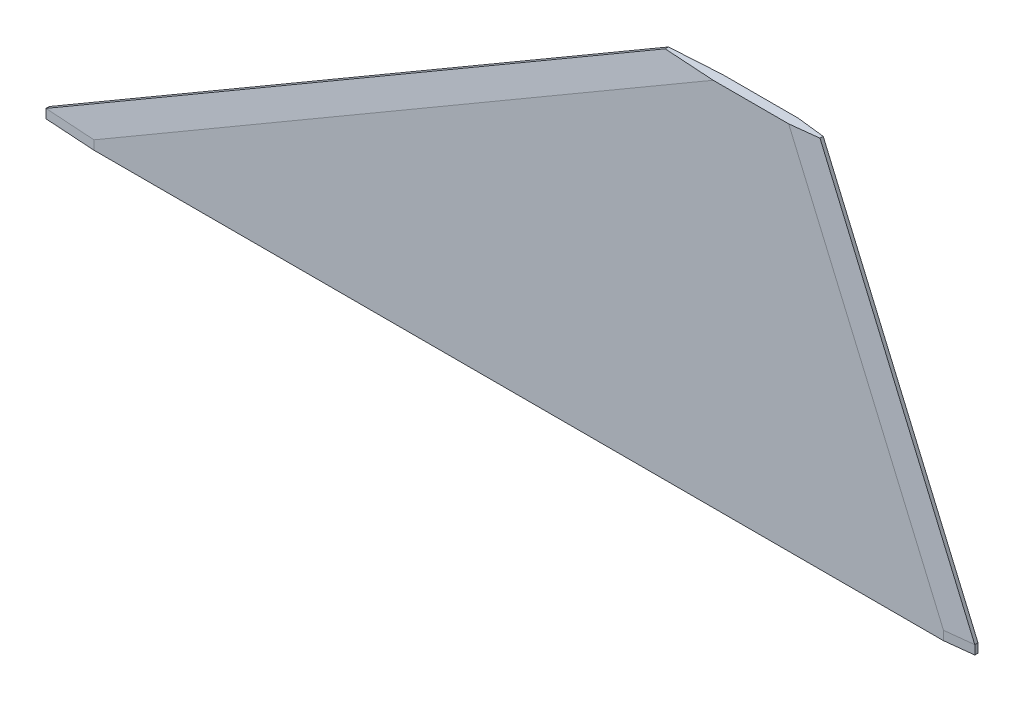
ISO-10303-21;
HEADER;
FILE_DESCRIPTION(('STEP AP214'),'2;1');
FILE_NAME('part.step','',(''),(''),'','','');
FILE_SCHEMA(('AUTOMOTIVE_DESIGN { 1 0 10303 214 1 1 1 1 }'));
ENDSEC;
DATA;
#1=APPLICATION_CONTEXT('core data for automotive mechanical design processes');
#2=APPLICATION_PROTOCOL_DEFINITION('international standard','automotive_design',2000,#1);
#3=PRODUCT_CONTEXT('',#1,'mechanical');
#4=PRODUCT('Part','Part','',(#3));
#5=PRODUCT_RELATED_PRODUCT_CATEGORY('part','',(#4));
#6=PRODUCT_DEFINITION_FORMATION('','',#4);
#7=PRODUCT_DEFINITION_CONTEXT('part definition',#1,'design');
#8=PRODUCT_DEFINITION('design','',#6,#7);
#9=PRODUCT_DEFINITION_SHAPE('','',#8);
#10=(LENGTH_UNIT() NAMED_UNIT(*) SI_UNIT(.MILLI.,.METRE.));
#11=(NAMED_UNIT(*) PLANE_ANGLE_UNIT() SI_UNIT($,.RADIAN.));
#12=(NAMED_UNIT(*) SI_UNIT($,.STERADIAN.) SOLID_ANGLE_UNIT());
#13=UNCERTAINTY_MEASURE_WITH_UNIT(LENGTH_MEASURE(1.E-05),#10,'distance_accuracy_value','');
#14=(GEOMETRIC_REPRESENTATION_CONTEXT(3) GLOBAL_UNCERTAINTY_ASSIGNED_CONTEXT((#13)) GLOBAL_UNIT_ASSIGNED_CONTEXT((#10,
#11,#12)) REPRESENTATION_CONTEXT('',''));
#15=CARTESIAN_POINT('',(0.,0.,0.));
#16=DIRECTION('',(0.,0.,1.));
#17=DIRECTION('',(1.,0.,0.));
#18=AXIS2_PLACEMENT_3D('',#15,#16,#17);
#19=CARTESIAN_POINT('',(304.8,177.8,4.7625));
#20=DIRECTION('',(0.503871025524086,-0.863778900898433,0.));
#21=DIRECTION('',(0.863778900898433,0.503871025524086,0.));
#22=AXIS2_PLACEMENT_3D('',#19,#20,#21);
#23=PLANE('',#22);
#24=DIRECTION('',(0.,0.,-1.));
#25=VECTOR('',#24,1.);
#26=CARTESIAN_POINT('',(304.8,177.8,4.7625));
#27=LINE('',#26,#25);
#28=CARTESIAN_POINT('',(304.8,177.8,3.17499999999999));
#29=VERTEX_POINT('',#28);
#30=CARTESIAN_POINT('',(304.8,177.8,1.5875));
#31=VERTEX_POINT('',#30);
#32=EDGE_CURVE('E154',#29,#31,#27,.T.);
#33=ORIENTED_EDGE('',*,*,#32,.T.);
#34=DIRECTION('',(-0.863778900898433,-0.503871025524086,0.));
#35=VECTOR('',#34,1.);
#36=CARTESIAN_POINT('',(0.,0.,1.5875));
#37=LINE('',#36,#35);
#38=CARTESIAN_POINT('',(0.,0.,1.5875));
#39=VERTEX_POINT('',#38);
#40=EDGE_CURVE('E168',#31,#39,#37,.T.);
#41=ORIENTED_EDGE('',*,*,#40,.T.);
#42=DIRECTION('',(0.,0.,-1.));
#43=VECTOR('',#42,1.);
#44=CARTESIAN_POINT('',(0.,0.,4.7625));
#45=LINE('',#44,#43);
#46=CARTESIAN_POINT('',(0.,0.,3.17499999999999));
#47=VERTEX_POINT('',#46);
#48=EDGE_CURVE('E163',#47,#39,#45,.T.);
#49=ORIENTED_EDGE('',*,*,#48,.F.);
#50=DIRECTION('',(0.863778900898433,0.503871025524086,0.));
#51=VECTOR('',#50,1.);
#52=CARTESIAN_POINT('',(304.8,177.8,3.17499999999999));
#53=LINE('',#52,#51);
#54=EDGE_CURVE('E166',#47,#29,#53,.T.);
#55=ORIENTED_EDGE('',*,*,#54,.T.);
#56=EDGE_LOOP('',(#33,#41,#49,#55));
#57=FACE_BOUND('',#56,.T.);
#58=ADVANCED_FACE('F34',(#57),#23,.F.);
#59=CARTESIAN_POINT('',(457.2,0.,4.7625));
#60=DIRECTION('',(-0.919145030018058,-0.393919298579168,0.));
#61=DIRECTION('',(0.393919298579168,-0.919145030018058,0.));
#62=AXIS2_PLACEMENT_3D('',#59,#60,#61);
#63=PLANE('',#62);
#64=DIRECTION('',(0.,0.,-1.));
#65=VECTOR('',#64,1.);
#66=CARTESIAN_POINT('',(457.2,0.,4.7625));
#67=LINE('',#66,#65);
#68=CARTESIAN_POINT('',(457.2,0.,3.17499999999998));
#69=VERTEX_POINT('',#68);
#70=CARTESIAN_POINT('',(457.2,0.,1.5875));
#71=VERTEX_POINT('',#70);
#72=EDGE_CURVE('E161',#69,#71,#67,.T.);
#73=ORIENTED_EDGE('',*,*,#72,.T.);
#74=DIRECTION('',(-0.393919298579168,0.919145030018058,0.));
#75=VECTOR('',#74,1.);
#76=CARTESIAN_POINT('',(381.,177.8,1.5875));
#77=LINE('',#76,#75);
#78=CARTESIAN_POINT('',(381.,177.8,1.5875));
#79=VERTEX_POINT('',#78);
#80=EDGE_CURVE('E187',#71,#79,#77,.T.);
#81=ORIENTED_EDGE('',*,*,#80,.T.);
#82=DIRECTION('',(0.,0.,-1.));
#83=VECTOR('',#82,1.);
#84=CARTESIAN_POINT('',(381.,177.8,4.7625));
#85=LINE('',#84,#83);
#86=CARTESIAN_POINT('',(381.,177.8,3.17499999999998));
#87=VERTEX_POINT('',#86);
#88=EDGE_CURVE('E158',#87,#79,#85,.T.);
#89=ORIENTED_EDGE('',*,*,#88,.F.);
#90=DIRECTION('',(0.393919298579168,-0.919145030018058,0.));
#91=VECTOR('',#90,1.);
#92=CARTESIAN_POINT('',(457.2,0.,3.17499999999998));
#93=LINE('',#92,#91);
#94=EDGE_CURVE('E185',#87,#69,#93,.T.);
#95=ORIENTED_EDGE('',*,*,#94,.T.);
#96=EDGE_LOOP('',(#73,#81,#89,#95));
#97=FACE_BOUND('',#96,.T.);
#98=ADVANCED_FACE('F263',(#97),#63,.F.);
#99=CARTESIAN_POINT('',(381.,177.8,4.7625));
#100=DIRECTION('',(0.,-1.,0.));
#101=DIRECTION('',(0.,0.,-1.));
#102=AXIS2_PLACEMENT_3D('',#99,#100,#101);
#103=PLANE('',#102);
#104=ORIENTED_EDGE('',*,*,#88,.T.);
#105=DIRECTION('',(-0.993464418144731,0.,-0.114142235304689));
#106=VECTOR('',#105,1.);
#107=CARTESIAN_POINT('',(456.207232119117,177.8,10.2282942029627));
#108=LINE('',#107,#106);
#109=CARTESIAN_POINT('',(367.18281165079,177.8,0.));
#110=VERTEX_POINT('',#109);
#111=EDGE_CURVE('E192',#79,#110,#108,.T.);
#112=ORIENTED_EDGE('',*,*,#111,.T.);
#113=DIRECTION('',(-1.,0.,0.));
#114=VECTOR('',#113,1.);
#115=CARTESIAN_POINT('',(381.,177.8,0.));
#116=LINE('',#115,#114);
#117=CARTESIAN_POINT('',(330.004862666573,177.8,0.));
#118=VERTEX_POINT('',#117);
#119=EDGE_CURVE('E146',#110,#118,#116,.T.);
#120=ORIENTED_EDGE('',*,*,#119,.T.);
#121=DIRECTION('',(-0.998022397418784,0.,0.0628593211104263));
#122=VECTOR('',#121,1.);
#123=CARTESIAN_POINT('',(304.8,177.8,1.5875));
#124=LINE('',#123,#122);
#125=EDGE_CURVE('E180',#118,#31,#124,.T.);
#126=ORIENTED_EDGE('',*,*,#125,.T.);
#127=ORIENTED_EDGE('',*,*,#32,.F.);
#128=DIRECTION('',(-0.998022397418784,0.,-0.0628593211104246));
#129=VECTOR('',#128,1.);
#130=CARTESIAN_POINT('',(7.67782336852167,177.8,-15.538906980656));
#131=LINE('',#130,#129);
#132=CARTESIAN_POINT('',(330.004862666574,177.8,4.7625));
#133=VERTEX_POINT('',#132);
#134=EDGE_CURVE('E177',#29,#133,#131,.F.);
#135=ORIENTED_EDGE('',*,*,#134,.T.);
#136=DIRECTION('',(-1.,0.,0.));
#137=VECTOR('',#136,1.);
#138=CARTESIAN_POINT('',(381.,177.8,4.7625));
#139=LINE('',#138,#137);
#140=CARTESIAN_POINT('',(367.182811650789,177.8,4.7625));
#141=VERTEX_POINT('',#140);
#142=EDGE_CURVE('E148',#141,#133,#139,.T.);
#143=ORIENTED_EDGE('',*,*,#142,.F.);
#144=DIRECTION('',(-0.993464418144731,0.,0.114142235304686));
#145=VECTOR('',#144,1.);
#146=CARTESIAN_POINT('',(374.485630180208,177.8,3.9234563304451));
#147=LINE('',#146,#145);
#148=EDGE_CURVE('E190',#141,#87,#147,.F.);
#149=ORIENTED_EDGE('',*,*,#148,.T.);
#150=EDGE_LOOP('',(#104,#112,#120,#126,#127,#135,#143,#149));
#151=FACE_BOUND('',#150,.T.);
#152=ADVANCED_FACE('F256',(#151),#103,.F.);
#153=CARTESIAN_POINT('',(0.,0.,4.7625));
#154=DIRECTION('',(0.,0.,-1.));
#155=DIRECTION('',(-1.,0.,0.));
#156=AXIS2_PLACEMENT_3D('',#153,#154,#155);
#157=PLANE('',#156);
#158=DIRECTION('',(-0.863778900898433,-0.503871025524086,0.));
#159=VECTOR('',#158,1.);
#160=CARTESIAN_POINT('',(6.39916202415609,-10.9699920414104,4.7625));
#161=LINE('',#160,#159);
#162=CARTESIAN_POINT('',(25.204862666574,0.,4.7625));
#163=VERTEX_POINT('',#162);
#164=EDGE_CURVE('E182',#133,#163,#161,.T.);
#165=ORIENTED_EDGE('',*,*,#164,.T.);
#166=DIRECTION('',(0.,1.,0.));
#167=VECTOR('',#166,1.);
#168=CARTESIAN_POINT('',(25.204862666574,-4.445,4.7625));
#169=LINE('',#168,#167);
#170=CARTESIAN_POINT('',(25.204862666574,-4.445,4.7625));
#171=VERTEX_POINT('',#170);
#172=EDGE_CURVE('E216',#171,#163,#169,.T.);
#173=ORIENTED_EDGE('',*,*,#172,.F.);
#174=DIRECTION('',(-1.,0.,0.));
#175=VECTOR('',#174,1.);
#176=CARTESIAN_POINT('',(443.382811650789,-4.445,4.7625));
#177=LINE('',#176,#175);
#178=CARTESIAN_POINT('',(443.382811650789,-4.445,4.7625));
#179=VERTEX_POINT('',#178);
#180=EDGE_CURVE('E227',#179,#171,#177,.T.);
#181=ORIENTED_EDGE('',*,*,#180,.F.);
#182=DIRECTION('',(0.,1.,0.));
#183=VECTOR('',#182,1.);
#184=CARTESIAN_POINT('',(443.382811650789,-4.445,4.7625));
#185=LINE('',#184,#183);
#186=CARTESIAN_POINT('',(443.382811650789,0.,4.7625));
#187=VERTEX_POINT('',#186);
#188=EDGE_CURVE('E211',#179,#187,#185,.T.);
#189=ORIENTED_EDGE('',*,*,#188,.T.);
#190=DIRECTION('',(-0.393919298579168,0.919145030018058,0.));
#191=VECTOR('',#190,1.);
#192=CARTESIAN_POINT('',(374.582030532563,160.535155942527,4.7625));
#193=LINE('',#192,#191);
#194=EDGE_CURVE('E11',#187,#141,#193,.T.);
#195=ORIENTED_EDGE('',*,*,#194,.T.);
#196=ORIENTED_EDGE('',*,*,#142,.T.);
#197=EDGE_LOOP('',(#165,#173,#181,#189,#195,#196));
#198=FACE_BOUND('',#197,.T.);
#199=ADVANCED_FACE('F239',(#198),#157,.F.);
#200=CARTESIAN_POINT('',(0.,0.,0.));
#201=DIRECTION('',(0.,0.,-1.));
#202=DIRECTION('',(-1.,0.,0.));
#203=AXIS2_PLACEMENT_3D('',#200,#201,#202);
#204=PLANE('',#203);
#205=ORIENTED_EDGE('',*,*,#119,.F.);
#206=DIRECTION('',(0.393919298579168,-0.919145030018058,0.));
#207=VECTOR('',#206,1.);
#208=CARTESIAN_POINT('',(445.526858118771,-5.00277509195542,0.));
#209=LINE('',#208,#207);
#210=CARTESIAN_POINT('',(443.38281165079,0.,0.));
#211=VERTEX_POINT('',#210);
#212=EDGE_CURVE('E55',#110,#211,#209,.T.);
#213=ORIENTED_EDGE('',*,*,#212,.T.);
#214=DIRECTION('',(0.,1.,0.));
#215=VECTOR('',#214,1.);
#216=CARTESIAN_POINT('',(443.38281165079,-4.445,0.));
#217=LINE('',#216,#215);
#218=CARTESIAN_POINT('',(443.38281165079,-4.445,0.));
#219=VERTEX_POINT('',#218);
#220=EDGE_CURVE('E130',#219,#211,#217,.T.);
#221=ORIENTED_EDGE('',*,*,#220,.F.);
#222=DIRECTION('',(1.,0.,0.));
#223=VECTOR('',#222,1.);
#224=CARTESIAN_POINT('',(25.2048626665733,-4.445,0.));
#225=LINE('',#224,#223);
#226=CARTESIAN_POINT('',(25.2048626665733,-4.445,0.));
#227=VERTEX_POINT('',#226);
#228=EDGE_CURVE('E122',#227,#219,#225,.T.);
#229=ORIENTED_EDGE('',*,*,#228,.F.);
#230=DIRECTION('',(0.,1.,0.));
#231=VECTOR('',#230,1.);
#232=CARTESIAN_POINT('',(25.2048626665733,-4.445,0.));
#233=LINE('',#232,#231);
#234=CARTESIAN_POINT('',(25.2048626665733,0.,0.));
#235=VERTEX_POINT('',#234);
#236=EDGE_CURVE('E127',#227,#235,#233,.T.);
#237=ORIENTED_EDGE('',*,*,#236,.T.);
#238=DIRECTION('',(0.863778900898433,0.503871025524086,0.));
#239=VECTOR('',#238,1.);
#240=CARTESIAN_POINT('',(311.199162024156,166.83000795859,0.));
#241=LINE('',#240,#239);
#242=EDGE_CURVE('E175',#235,#118,#241,.T.);
#243=ORIENTED_EDGE('',*,*,#242,.T.);
#244=EDGE_LOOP('',(#205,#213,#221,#229,#237,#243));
#245=FACE_BOUND('',#244,.T.);
#246=ADVANCED_FACE('F124',(#245),#204,.T.);
#247=CARTESIAN_POINT('',(304.8,177.8,1.5875));
#248=DIRECTION('',(-0.0624975089180724,0.107138586716695,-0.992277876713668));
#249=DIRECTION('',(0.863778900898433,0.503871025524086,0.));
#250=AXIS2_PLACEMENT_3D('',#247,#248,#249);
#251=PLANE('',#250);
#252=ORIENTED_EDGE('',*,*,#125,.F.);
#253=ORIENTED_EDGE('',*,*,#242,.F.);
#254=DIRECTION('',(0.998022397418784,0.,-0.0628593211104263));
#255=VECTOR('',#254,1.);
#256=CARTESIAN_POINT('',(303.595645512459,0.,-17.5341311561262));
#257=LINE('',#256,#255);
#258=EDGE_CURVE('E145',#39,#235,#257,.T.);
#259=ORIENTED_EDGE('',*,*,#258,.F.);
#260=ORIENTED_EDGE('',*,*,#40,.F.);
#261=EDGE_LOOP('',(#252,#253,#259,#260));
#262=FACE_BOUND('',#261,.T.);
#263=ADVANCED_FACE('F259',(#262),#251,.T.);
#264=CARTESIAN_POINT('',(6.39916202415609,-10.9699920414104,4.7625));
#265=DIRECTION('',(0.0624975089180707,-0.107138586716693,-0.992277876713668));
#266=DIRECTION('',(-0.863778900898433,-0.503871025524086,0.));
#267=AXIS2_PLACEMENT_3D('',#264,#265,#266);
#268=PLANE('',#267);
#269=ORIENTED_EDGE('',*,*,#134,.F.);
#270=ORIENTED_EDGE('',*,*,#54,.F.);
#271=DIRECTION('',(0.998022397418784,0.,0.0628593211104246));
#272=VECTOR('',#271,1.);
#273=CARTESIAN_POINT('',(6.47346888098041,0.,3.58272417546972));
#274=LINE('',#273,#272);
#275=EDGE_CURVE('E171',#163,#47,#274,.F.);
#276=ORIENTED_EDGE('',*,*,#275,.F.);
#277=ORIENTED_EDGE('',*,*,#164,.F.);
#278=EDGE_LOOP('',(#269,#270,#276,#277));
#279=FACE_BOUND('',#278,.T.);
#280=ADVANCED_FACE('F252',(#279),#268,.F.);
#281=CARTESIAN_POINT('',(457.2,0.,1.5875));
#282=DIRECTION('',(0.11400590984728,0.0488596756488344,-0.992277876713668));
#283=DIRECTION('',(0.393919298579168,-0.919145030018058,0.));
#284=AXIS2_PLACEMENT_3D('',#281,#282,#283);
#285=PLANE('',#284);
#286=DIRECTION('',(0.993464418144731,0.,0.114142235304689));
#287=VECTOR('',#286,1.);
#288=CARTESIAN_POINT('',(457.2,0.,1.5875));
#289=LINE('',#288,#287);
#290=EDGE_CURVE('E42',#211,#71,#289,.T.);
#291=ORIENTED_EDGE('',*,*,#290,.F.);
#292=ORIENTED_EDGE('',*,*,#212,.F.);
#293=ORIENTED_EDGE('',*,*,#111,.F.);
#294=ORIENTED_EDGE('',*,*,#80,.F.);
#295=EDGE_LOOP('',(#291,#292,#293,#294));
#296=FACE_BOUND('',#295,.T.);
#297=ADVANCED_FACE('F260',(#296),#285,.T.);
#298=CARTESIAN_POINT('',(374.582030532563,160.535155942527,4.7625));
#299=DIRECTION('',(-0.114005909847277,-0.0488596756488329,-0.992277876713668));
#300=DIRECTION('',(-0.393919298579168,0.919145030018058,0.));
#301=AXIS2_PLACEMENT_3D('',#298,#299,#300);
#302=PLANE('',#301);
#303=DIRECTION('',(0.993464418144731,0.,-0.114142235304686));
#304=VECTOR('',#303,1.);
#305=CARTESIAN_POINT('',(375.478398061091,0.,12.5642505334075));
#306=LINE('',#305,#304);
#307=EDGE_CURVE('E195',#69,#187,#306,.F.);
#308=ORIENTED_EDGE('',*,*,#307,.F.);
#309=ORIENTED_EDGE('',*,*,#94,.F.);
#310=ORIENTED_EDGE('',*,*,#148,.F.);
#311=ORIENTED_EDGE('',*,*,#194,.F.);
#312=EDGE_LOOP('',(#308,#309,#310,#311));
#313=FACE_BOUND('',#312,.T.);
#314=ADVANCED_FACE('F36',(#313),#302,.F.);
#315=CARTESIAN_POINT('',(0.,-4.445,1.5875));
#316=DIRECTION('',(0.0628593211104259,0.,0.998022397418784));
#317=DIRECTION('',(0.998022397418784,0.,-0.0628593211104259));
#318=AXIS2_PLACEMENT_3D('',#315,#316,#317);
#319=PLANE('',#318);
#320=ORIENTED_EDGE('',*,*,#258,.T.);
#321=ORIENTED_EDGE('',*,*,#236,.F.);
#322=DIRECTION('',(0.998022397418784,0.,-0.0628593211104259));
#323=VECTOR('',#322,1.);
#324=CARTESIAN_POINT('',(0.,-4.445,1.5875));
#325=LINE('',#324,#323);
#326=CARTESIAN_POINT('',(0.,-4.445,1.5875));
#327=VERTEX_POINT('',#326);
#328=EDGE_CURVE('E134',#327,#227,#325,.T.);
#329=ORIENTED_EDGE('',*,*,#328,.F.);
#330=DIRECTION('',(0.,1.,0.));
#331=VECTOR('',#330,1.);
#332=CARTESIAN_POINT('',(0.,-4.445,1.5875));
#333=LINE('',#332,#331);
#334=EDGE_CURVE('E222',#327,#39,#333,.T.);
#335=ORIENTED_EDGE('',*,*,#334,.T.);
#336=EDGE_LOOP('',(#320,#321,#329,#335));
#337=FACE_BOUND('',#336,.T.);
#338=ADVANCED_FACE('F144',(#337),#319,.F.);
#339=CARTESIAN_POINT('',(443.38281165079,-4.445,0.));
#340=DIRECTION('',(-0.114142235304689,0.,0.993464418144731));
#341=DIRECTION('',(0.993464418144731,0.,0.114142235304689));
#342=AXIS2_PLACEMENT_3D('',#339,#340,#341);
#343=PLANE('',#342);
#344=ORIENTED_EDGE('',*,*,#290,.T.);
#345=DIRECTION('',(0.,1.,0.));
#346=VECTOR('',#345,1.);
#347=CARTESIAN_POINT('',(457.2,-4.445,1.5875));
#348=LINE('',#347,#346);
#349=CARTESIAN_POINT('',(457.2,-4.445,1.5875));
#350=VERTEX_POINT('',#349);
#351=EDGE_CURVE('E150',#350,#71,#348,.T.);
#352=ORIENTED_EDGE('',*,*,#351,.F.);
#353=DIRECTION('',(0.993464418144731,0.,0.114142235304689));
#354=VECTOR('',#353,1.);
#355=CARTESIAN_POINT('',(443.38281165079,-4.445,0.));
#356=LINE('',#355,#354);
#357=EDGE_CURVE('E133',#219,#350,#356,.T.);
#358=ORIENTED_EDGE('',*,*,#357,.F.);
#359=ORIENTED_EDGE('',*,*,#220,.T.);
#360=EDGE_LOOP('',(#344,#352,#358,#359));
#361=FACE_BOUND('',#360,.T.);
#362=ADVANCED_FACE('F200',(#361),#343,.F.);
#363=CARTESIAN_POINT('',(457.2,-4.445,1.5875));
#364=DIRECTION('',(-1.,0.,0.));
#365=DIRECTION('',(0.,0.,1.));
#366=AXIS2_PLACEMENT_3D('',#363,#364,#365);
#367=PLANE('',#366);
#368=ORIENTED_EDGE('',*,*,#72,.F.);
#369=DIRECTION('',(0.,1.,0.));
#370=VECTOR('',#369,1.);
#371=CARTESIAN_POINT('',(457.2,-4.445,3.17499999999998));
#372=LINE('',#371,#370);
#373=CARTESIAN_POINT('',(457.2,-4.445,3.17499999999998));
#374=VERTEX_POINT('',#373);
#375=EDGE_CURVE('E210',#374,#69,#372,.T.);
#376=ORIENTED_EDGE('',*,*,#375,.F.);
#377=DIRECTION('',(0.,0.,1.));
#378=VECTOR('',#377,1.);
#379=CARTESIAN_POINT('',(457.2,-4.445,1.5875));
#380=LINE('',#379,#378);
#381=EDGE_CURVE('E209',#350,#374,#380,.T.);
#382=ORIENTED_EDGE('',*,*,#381,.F.);
#383=ORIENTED_EDGE('',*,*,#351,.T.);
#384=EDGE_LOOP('',(#368,#376,#382,#383));
#385=FACE_BOUND('',#384,.T.);
#386=ADVANCED_FACE('F206',(#385),#367,.F.);
#387=CARTESIAN_POINT('',(457.2,-4.445,3.17499999999998));
#388=DIRECTION('',(-0.114142235304686,0.,-0.993464418144731));
#389=DIRECTION('',(-0.993464418144732,0.,0.114142235304686));
#390=AXIS2_PLACEMENT_3D('',#387,#388,#389);
#391=PLANE('',#390);
#392=ORIENTED_EDGE('',*,*,#307,.T.);
#393=ORIENTED_EDGE('',*,*,#188,.F.);
#394=DIRECTION('',(-0.993464418144731,0.,0.114142235304686));
#395=VECTOR('',#394,1.);
#396=CARTESIAN_POINT('',(457.2,-4.445,3.17499999999998));
#397=LINE('',#396,#395);
#398=EDGE_CURVE('E229',#374,#179,#397,.T.);
#399=ORIENTED_EDGE('',*,*,#398,.F.);
#400=ORIENTED_EDGE('',*,*,#375,.T.);
#401=EDGE_LOOP('',(#392,#393,#399,#400));
#402=FACE_BOUND('',#401,.T.);
#403=ADVANCED_FACE('F235',(#402),#391,.F.);
#404=CARTESIAN_POINT('',(25.204862666574,-4.445,4.7625));
#405=DIRECTION('',(0.0628593211104246,0.,-0.998022397418784));
#406=DIRECTION('',(-0.998022397418784,0.,-0.0628593211104246));
#407=AXIS2_PLACEMENT_3D('',#404,#405,#406);
#408=PLANE('',#407);
#409=ORIENTED_EDGE('',*,*,#275,.T.);
#410=DIRECTION('',(0.,1.,0.));
#411=VECTOR('',#410,1.);
#412=CARTESIAN_POINT('',(0.,-4.445,3.17499999999999));
#413=LINE('',#412,#411);
#414=CARTESIAN_POINT('',(0.,-4.445,3.17499999999999));
#415=VERTEX_POINT('',#414);
#416=EDGE_CURVE('E219',#415,#47,#413,.T.);
#417=ORIENTED_EDGE('',*,*,#416,.F.);
#418=DIRECTION('',(-0.998022397418784,0.,-0.0628593211104246));
#419=VECTOR('',#418,1.);
#420=CARTESIAN_POINT('',(25.204862666574,-4.445,4.7625));
#421=LINE('',#420,#419);
#422=EDGE_CURVE('E225',#171,#415,#421,.T.);
#423=ORIENTED_EDGE('',*,*,#422,.F.);
#424=ORIENTED_EDGE('',*,*,#172,.T.);
#425=EDGE_LOOP('',(#409,#417,#423,#424));
#426=FACE_BOUND('',#425,.T.);
#427=ADVANCED_FACE('F243',(#426),#408,.F.);
#428=CARTESIAN_POINT('',(0.,-4.445,3.17499999999999));
#429=DIRECTION('',(1.,0.,0.));
#430=DIRECTION('',(0.,0.,-1.));
#431=AXIS2_PLACEMENT_3D('',#428,#429,#430);
#432=PLANE('',#431);
#433=ORIENTED_EDGE('',*,*,#48,.T.);
#434=ORIENTED_EDGE('',*,*,#334,.F.);
#435=DIRECTION('',(0.,0.,-1.));
#436=VECTOR('',#435,1.);
#437=CARTESIAN_POINT('',(0.,-4.445,3.17499999999999));
#438=LINE('',#437,#436);
#439=EDGE_CURVE('E139',#415,#327,#438,.T.);
#440=ORIENTED_EDGE('',*,*,#439,.F.);
#441=ORIENTED_EDGE('',*,*,#416,.T.);
#442=EDGE_LOOP('',(#433,#434,#440,#441));
#443=FACE_BOUND('',#442,.T.);
#444=ADVANCED_FACE('F245',(#443),#432,.F.);
#445=CARTESIAN_POINT('',(0.,-4.445,0.));
#446=DIRECTION('',(0.,-1.,0.));
#447=DIRECTION('',(0.,0.,-1.));
#448=AXIS2_PLACEMENT_3D('',#445,#446,#447);
#449=PLANE('',#448);
#450=ORIENTED_EDGE('',*,*,#328,.T.);
#451=ORIENTED_EDGE('',*,*,#228,.T.);
#452=ORIENTED_EDGE('',*,*,#357,.T.);
#453=ORIENTED_EDGE('',*,*,#381,.T.);
#454=ORIENTED_EDGE('',*,*,#398,.T.);
#455=ORIENTED_EDGE('',*,*,#180,.T.);
#456=ORIENTED_EDGE('',*,*,#422,.T.);
#457=ORIENTED_EDGE('',*,*,#439,.T.);
#458=EDGE_LOOP('',(#450,#451,#452,#453,#454,#455,#456,#457));
#459=FACE_BOUND('',#458,.T.);
#460=ADVANCED_FACE('F137',(#459),#449,.T.);
#461=CLOSED_SHELL('',(#58,#98,#152,#199,#246,#263,#280,#297,#314,#338,#362,#386,#403,#427,#444,#460));
#462=MANIFOLD_SOLID_BREP('B2',#461);
#463=ADVANCED_BREP_SHAPE_REPRESENTATION('',(#18,#462),#14);
#464=SHAPE_DEFINITION_REPRESENTATION(#9,#463);
ENDSEC;
END-ISO-10303-21;
